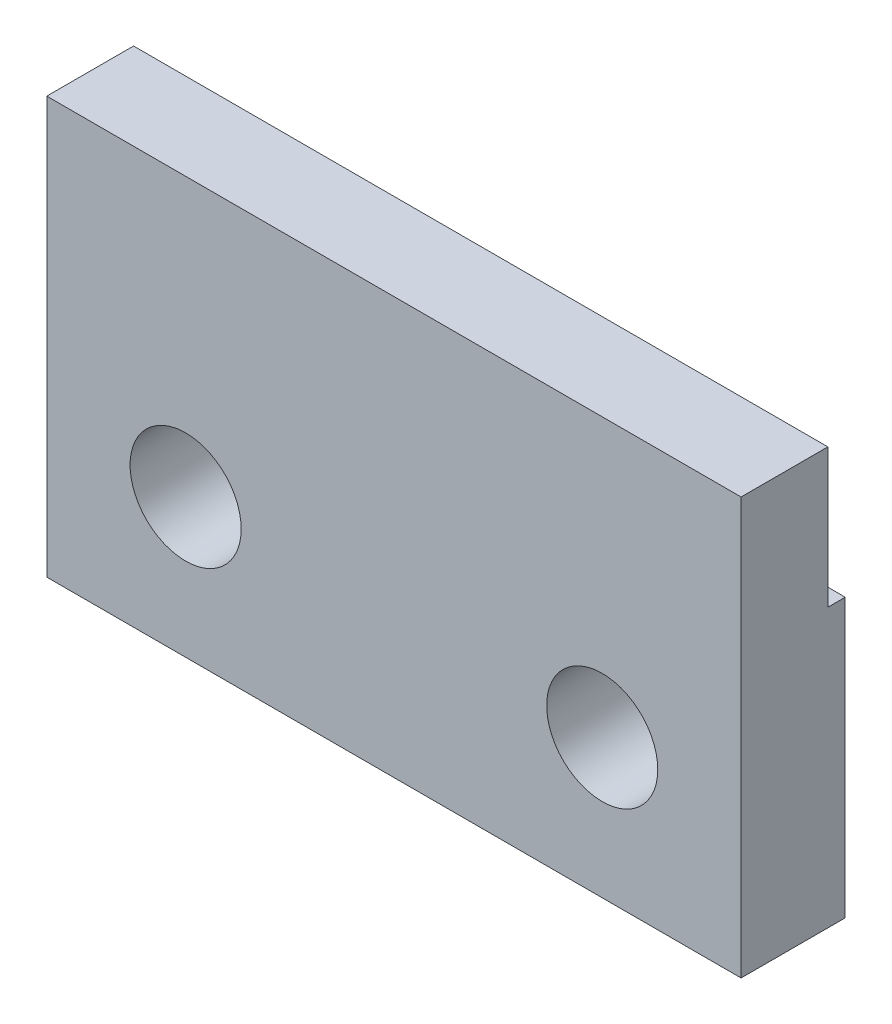
ISO-10303-21;
HEADER;
FILE_DESCRIPTION(('STEP AP214'),'2;1');
FILE_NAME('part.step','',(''),(''),'','','');
FILE_SCHEMA(('AUTOMOTIVE_DESIGN { 1 0 10303 214 1 1 1 1 }'));
ENDSEC;
DATA;
#1=APPLICATION_CONTEXT('core data for automotive mechanical design processes');
#2=APPLICATION_PROTOCOL_DEFINITION('international standard','automotive_design',2000,#1);
#3=PRODUCT_CONTEXT('',#1,'mechanical');
#4=PRODUCT('Part','Part','',(#3));
#5=PRODUCT_RELATED_PRODUCT_CATEGORY('part','',(#4));
#6=PRODUCT_DEFINITION_FORMATION('','',#4);
#7=PRODUCT_DEFINITION_CONTEXT('part definition',#1,'design');
#8=PRODUCT_DEFINITION('design','',#6,#7);
#9=PRODUCT_DEFINITION_SHAPE('','',#8);
#10=(LENGTH_UNIT() NAMED_UNIT(*) SI_UNIT(.MILLI.,.METRE.));
#11=(NAMED_UNIT(*) PLANE_ANGLE_UNIT() SI_UNIT($,.RADIAN.));
#12=(NAMED_UNIT(*) SI_UNIT($,.STERADIAN.) SOLID_ANGLE_UNIT());
#13=UNCERTAINTY_MEASURE_WITH_UNIT(LENGTH_MEASURE(1.E-05),#10,'distance_accuracy_value','');
#14=(GEOMETRIC_REPRESENTATION_CONTEXT(3) GLOBAL_UNCERTAINTY_ASSIGNED_CONTEXT((#13)) GLOBAL_UNIT_ASSIGNED_CONTEXT((#10,
#11,#12)) REPRESENTATION_CONTEXT('',''));
#15=CARTESIAN_POINT('',(0.,0.,0.));
#16=DIRECTION('',(0.,0.,1.));
#17=DIRECTION('',(1.,0.,0.));
#18=AXIS2_PLACEMENT_3D('',#15,#16,#17);
#19=CARTESIAN_POINT('',(10.,6.,3.));
#20=DIRECTION('',(0.,-1.,0.));
#21=DIRECTION('',(1.,0.,0.));
#22=AXIS2_PLACEMENT_3D('',#19,#20,#21);
#23=PLANE('',#22);
#24=DIRECTION('',(1.,0.,0.));
#25=VECTOR('',#24,1.);
#26=CARTESIAN_POINT('',(10.,6.,0.5));
#27=LINE('',#26,#25);
#28=CARTESIAN_POINT('',(-10.,6.,0.5));
#29=VERTEX_POINT('',#28);
#30=CARTESIAN_POINT('',(10.,6.,0.5));
#31=VERTEX_POINT('',#30);
#32=EDGE_CURVE('E108',#29,#31,#27,.T.);
#33=ORIENTED_EDGE('',*,*,#32,.F.);
#34=DIRECTION('',(0.,0.,-1.));
#35=VECTOR('',#34,1.);
#36=CARTESIAN_POINT('',(-10.,6.,3.));
#37=LINE('',#36,#35);
#38=CARTESIAN_POINT('',(-10.,6.,3.));
#39=VERTEX_POINT('',#38);
#40=EDGE_CURVE('E130',#39,#29,#37,.T.);
#41=ORIENTED_EDGE('',*,*,#40,.F.);
#42=DIRECTION('',(-1.,0.,0.));
#43=VECTOR('',#42,1.);
#44=CARTESIAN_POINT('',(10.,6.,3.));
#45=LINE('',#44,#43);
#46=CARTESIAN_POINT('',(10.,6.,3.));
#47=VERTEX_POINT('',#46);
#48=EDGE_CURVE('E61',#47,#39,#45,.T.);
#49=ORIENTED_EDGE('',*,*,#48,.F.);
#50=DIRECTION('',(0.,0.,-1.));
#51=VECTOR('',#50,1.);
#52=CARTESIAN_POINT('',(10.,6.,3.));
#53=LINE('',#52,#51);
#54=EDGE_CURVE('E136',#47,#31,#53,.T.);
#55=ORIENTED_EDGE('',*,*,#54,.T.);
#56=EDGE_LOOP('',(#33,#41,#49,#55));
#57=FACE_BOUND('',#56,.T.);
#58=ADVANCED_FACE('F37',(#57),#23,.F.);
#59=CARTESIAN_POINT('',(-10.,-6.,3.));
#60=DIRECTION('',(1.,0.,0.));
#61=DIRECTION('',(0.,0.,-1.));
#62=AXIS2_PLACEMENT_3D('',#59,#60,#61);
#63=PLANE('',#62);
#64=DIRECTION('',(0.,1.,0.));
#65=VECTOR('',#64,1.);
#66=CARTESIAN_POINT('',(-10.,6.,0.5));
#67=LINE('',#66,#65);
#68=CARTESIAN_POINT('',(-10.,2.,0.5));
#69=VERTEX_POINT('',#68);
#70=EDGE_CURVE('E102',#69,#29,#67,.T.);
#71=ORIENTED_EDGE('',*,*,#70,.F.);
#72=DIRECTION('',(0.,0.,-1.));
#73=VECTOR('',#72,1.);
#74=CARTESIAN_POINT('',(-10.,2.,0.5));
#75=LINE('',#74,#73);
#76=CARTESIAN_POINT('',(-10.,2.,0.));
#77=VERTEX_POINT('',#76);
#78=EDGE_CURVE('E99',#69,#77,#75,.T.);
#79=ORIENTED_EDGE('',*,*,#78,.T.);
#80=DIRECTION('',(0.,-1.,0.));
#81=VECTOR('',#80,1.);
#82=CARTESIAN_POINT('',(-10.,-6.,0.));
#83=LINE('',#82,#81);
#84=CARTESIAN_POINT('',(-10.,-6.,0.));
#85=VERTEX_POINT('',#84);
#86=EDGE_CURVE('E119',#77,#85,#83,.T.);
#87=ORIENTED_EDGE('',*,*,#86,.T.);
#88=DIRECTION('',(0.,0.,-1.));
#89=VECTOR('',#88,1.);
#90=CARTESIAN_POINT('',(-10.,-6.,3.));
#91=LINE('',#90,#89);
#92=CARTESIAN_POINT('',(-10.,-6.,3.));
#93=VERTEX_POINT('',#92);
#94=EDGE_CURVE('E11',#93,#85,#91,.T.);
#95=ORIENTED_EDGE('',*,*,#94,.F.);
#96=DIRECTION('',(0.,-1.,0.));
#97=VECTOR('',#96,1.);
#98=CARTESIAN_POINT('',(-10.,-6.,3.));
#99=LINE('',#98,#97);
#100=EDGE_CURVE('E124',#39,#93,#99,.T.);
#101=ORIENTED_EDGE('',*,*,#100,.F.);
#102=ORIENTED_EDGE('',*,*,#40,.T.);
#103=EDGE_LOOP('',(#71,#79,#87,#95,#101,#102));
#104=FACE_BOUND('',#103,.T.);
#105=ADVANCED_FACE('F39',(#104),#63,.F.);
#106=CARTESIAN_POINT('',(10.,-6.,3.));
#107=DIRECTION('',(0.,1.,0.));
#108=DIRECTION('',(-1.,0.,0.));
#109=AXIS2_PLACEMENT_3D('',#106,#107,#108);
#110=PLANE('',#109);
#111=DIRECTION('',(1.,0.,0.));
#112=VECTOR('',#111,1.);
#113=CARTESIAN_POINT('',(10.,-6.,0.));
#114=LINE('',#113,#112);
#115=CARTESIAN_POINT('',(10.,-6.,0.));
#116=VERTEX_POINT('',#115);
#117=EDGE_CURVE('E76',#85,#116,#114,.T.);
#118=ORIENTED_EDGE('',*,*,#117,.T.);
#119=DIRECTION('',(0.,0.,-1.));
#120=VECTOR('',#119,1.);
#121=CARTESIAN_POINT('',(10.,-6.,3.));
#122=LINE('',#121,#120);
#123=CARTESIAN_POINT('',(10.,-6.,3.));
#124=VERTEX_POINT('',#123);
#125=EDGE_CURVE('E45',#124,#116,#122,.T.);
#126=ORIENTED_EDGE('',*,*,#125,.F.);
#127=DIRECTION('',(1.,0.,0.));
#128=VECTOR('',#127,1.);
#129=CARTESIAN_POINT('',(10.,-6.,3.));
#130=LINE('',#129,#128);
#131=EDGE_CURVE('E81',#93,#124,#130,.T.);
#132=ORIENTED_EDGE('',*,*,#131,.F.);
#133=ORIENTED_EDGE('',*,*,#94,.T.);
#134=EDGE_LOOP('',(#118,#126,#132,#133));
#135=FACE_BOUND('',#134,.T.);
#136=ADVANCED_FACE('F166',(#135),#110,.F.);
#137=CARTESIAN_POINT('',(10.,-6.,3.));
#138=DIRECTION('',(-1.,0.,0.));
#139=DIRECTION('',(0.,0.,1.));
#140=AXIS2_PLACEMENT_3D('',#137,#138,#139);
#141=PLANE('',#140);
#142=DIRECTION('',(0.,1.,0.));
#143=VECTOR('',#142,1.);
#144=CARTESIAN_POINT('',(10.,-6.,0.));
#145=LINE('',#144,#143);
#146=CARTESIAN_POINT('',(10.,2.,0.));
#147=VERTEX_POINT('',#146);
#148=EDGE_CURVE('E117',#116,#147,#145,.T.);
#149=ORIENTED_EDGE('',*,*,#148,.T.);
#150=DIRECTION('',(0.,0.,-1.));
#151=VECTOR('',#150,1.);
#152=CARTESIAN_POINT('',(10.,2.,0.5));
#153=LINE('',#152,#151);
#154=CARTESIAN_POINT('',(10.,2.,0.5));
#155=VERTEX_POINT('',#154);
#156=EDGE_CURVE('E52',#155,#147,#153,.T.);
#157=ORIENTED_EDGE('',*,*,#156,.F.);
#158=DIRECTION('',(0.,-1.,0.));
#159=VECTOR('',#158,1.);
#160=CARTESIAN_POINT('',(10.,6.,0.5));
#161=LINE('',#160,#159);
#162=EDGE_CURVE('E103',#31,#155,#161,.T.);
#163=ORIENTED_EDGE('',*,*,#162,.F.);
#164=ORIENTED_EDGE('',*,*,#54,.F.);
#165=DIRECTION('',(0.,1.,0.));
#166=VECTOR('',#165,1.);
#167=CARTESIAN_POINT('',(10.,-6.,3.));
#168=LINE('',#167,#166);
#169=EDGE_CURVE('E127',#124,#47,#168,.T.);
#170=ORIENTED_EDGE('',*,*,#169,.F.);
#171=ORIENTED_EDGE('',*,*,#125,.T.);
#172=EDGE_LOOP('',(#149,#157,#163,#164,#170,#171));
#173=FACE_BOUND('',#172,.T.);
#174=ADVANCED_FACE('F115',(#173),#141,.F.);
#175=CARTESIAN_POINT('',(0.,0.,3.));
#176=DIRECTION('',(0.,0.,1.));
#177=DIRECTION('',(1.,0.,0.));
#178=AXIS2_PLACEMENT_3D('',#175,#176,#177);
#179=PLANE('',#178);
#180=CARTESIAN_POINT('',(-6.,-2.,3.));
#181=DIRECTION('',(0.,0.,1.));
#182=DIRECTION('',(1.,0.,0.));
#183=AXIS2_PLACEMENT_3D('',#180,#181,#182);
#184=CIRCLE('',#183,1.6);
#185=CARTESIAN_POINT('',(-4.4,-2.,3.));
#186=VERTEX_POINT('',#185);
#187=EDGE_CURVE('E152',#186,#186,#184,.T.);
#188=ORIENTED_EDGE('',*,*,#187,.F.);
#189=EDGE_LOOP('',(#188));
#190=FACE_BOUND('',#189,.T.);
#191=CARTESIAN_POINT('',(6.,-2.,3.));
#192=DIRECTION('',(0.,0.,1.));
#193=DIRECTION('',(1.,0.,0.));
#194=AXIS2_PLACEMENT_3D('',#191,#192,#193);
#195=CIRCLE('',#194,1.6);
#196=CARTESIAN_POINT('',(7.6,-2.,3.));
#197=VERTEX_POINT('',#196);
#198=EDGE_CURVE('E143',#197,#197,#195,.T.);
#199=ORIENTED_EDGE('',*,*,#198,.F.);
#200=EDGE_LOOP('',(#199));
#201=FACE_BOUND('',#200,.T.);
#202=ORIENTED_EDGE('',*,*,#100,.T.);
#203=ORIENTED_EDGE('',*,*,#131,.T.);
#204=ORIENTED_EDGE('',*,*,#169,.T.);
#205=ORIENTED_EDGE('',*,*,#48,.T.);
#206=EDGE_LOOP('',(#202,#203,#204,#205));
#207=FACE_BOUND('',#206,.T.);
#208=ADVANCED_FACE('F158',(#190,#201,#207),#179,.T.);
#209=CARTESIAN_POINT('',(0.,0.,0.));
#210=DIRECTION('',(0.,0.,1.));
#211=DIRECTION('',(1.,0.,0.));
#212=AXIS2_PLACEMENT_3D('',#209,#210,#211);
#213=PLANE('',#212);
#214=CARTESIAN_POINT('',(-6.,-2.,0.));
#215=DIRECTION('',(0.,0.,1.));
#216=DIRECTION('',(1.,0.,0.));
#217=AXIS2_PLACEMENT_3D('',#214,#215,#216);
#218=CIRCLE('',#217,1.6);
#219=CARTESIAN_POINT('',(-4.4,-2.,0.));
#220=VERTEX_POINT('',#219);
#221=EDGE_CURVE('E149',#220,#220,#218,.T.);
#222=ORIENTED_EDGE('',*,*,#221,.T.);
#223=EDGE_LOOP('',(#222));
#224=FACE_BOUND('',#223,.T.);
#225=CARTESIAN_POINT('',(6.,-2.,0.));
#226=DIRECTION('',(0.,0.,1.));
#227=DIRECTION('',(1.,0.,0.));
#228=AXIS2_PLACEMENT_3D('',#225,#226,#227);
#229=CIRCLE('',#228,1.6);
#230=CARTESIAN_POINT('',(7.6,-2.,0.));
#231=VERTEX_POINT('',#230);
#232=EDGE_CURVE('E141',#231,#231,#229,.T.);
#233=ORIENTED_EDGE('',*,*,#232,.T.);
#234=EDGE_LOOP('',(#233));
#235=FACE_BOUND('',#234,.T.);
#236=ORIENTED_EDGE('',*,*,#86,.F.);
#237=DIRECTION('',(-1.,0.,0.));
#238=VECTOR('',#237,1.);
#239=CARTESIAN_POINT('',(10.,2.,0.));
#240=LINE('',#239,#238);
#241=EDGE_CURVE('E112',#147,#77,#240,.T.);
#242=ORIENTED_EDGE('',*,*,#241,.F.);
#243=ORIENTED_EDGE('',*,*,#148,.F.);
#244=ORIENTED_EDGE('',*,*,#117,.F.);
#245=EDGE_LOOP('',(#236,#242,#243,#244));
#246=FACE_BOUND('',#245,.T.);
#247=ADVANCED_FACE('F140',(#224,#235,#246),#213,.F.);
#248=CARTESIAN_POINT('',(10.,2.,0.5));
#249=DIRECTION('',(0.,-1.,0.));
#250=DIRECTION('',(0.,0.,-1.));
#251=AXIS2_PLACEMENT_3D('',#248,#249,#250);
#252=PLANE('',#251);
#253=ORIENTED_EDGE('',*,*,#241,.T.);
#254=ORIENTED_EDGE('',*,*,#78,.F.);
#255=DIRECTION('',(-1.,0.,0.));
#256=VECTOR('',#255,1.);
#257=CARTESIAN_POINT('',(10.,2.,0.5));
#258=LINE('',#257,#256);
#259=EDGE_CURVE('E95',#155,#69,#258,.T.);
#260=ORIENTED_EDGE('',*,*,#259,.F.);
#261=ORIENTED_EDGE('',*,*,#156,.T.);
#262=EDGE_LOOP('',(#253,#254,#260,#261));
#263=FACE_BOUND('',#262,.T.);
#264=ADVANCED_FACE('F97',(#263),#252,.F.);
#265=CARTESIAN_POINT('',(0.,0.,0.5));
#266=DIRECTION('',(0.,0.,-1.));
#267=DIRECTION('',(-1.,0.,0.));
#268=AXIS2_PLACEMENT_3D('',#265,#266,#267);
#269=PLANE('',#268);
#270=ORIENTED_EDGE('',*,*,#162,.T.);
#271=ORIENTED_EDGE('',*,*,#259,.T.);
#272=ORIENTED_EDGE('',*,*,#70,.T.);
#273=ORIENTED_EDGE('',*,*,#32,.T.);
#274=EDGE_LOOP('',(#270,#271,#272,#273));
#275=FACE_BOUND('',#274,.T.);
#276=ADVANCED_FACE('F106',(#275),#269,.T.);
#277=CARTESIAN_POINT('',(6.,-2.,3.));
#278=DIRECTION('',(0.,0.,1.));
#279=DIRECTION('',(1.,0.,0.));
#280=AXIS2_PLACEMENT_3D('',#277,#278,#279);
#281=CYLINDRICAL_SURFACE('',#280,1.6);
#282=ORIENTED_EDGE('',*,*,#232,.F.);
#283=EDGE_LOOP('',(#282));
#284=FACE_BOUND('',#283,.T.);
#285=ORIENTED_EDGE('',*,*,#198,.T.);
#286=EDGE_LOOP('',(#285));
#287=FACE_BOUND('',#286,.T.);
#288=ADVANCED_FACE('F186',(#284,#287),#281,.F.);
#289=CARTESIAN_POINT('',(-6.,-2.,3.));
#290=DIRECTION('',(0.,0.,1.));
#291=DIRECTION('',(1.,0.,0.));
#292=AXIS2_PLACEMENT_3D('',#289,#290,#291);
#293=CYLINDRICAL_SURFACE('',#292,1.6);
#294=ORIENTED_EDGE('',*,*,#221,.F.);
#295=EDGE_LOOP('',(#294));
#296=FACE_BOUND('',#295,.T.);
#297=ORIENTED_EDGE('',*,*,#187,.T.);
#298=EDGE_LOOP('',(#297));
#299=FACE_BOUND('',#298,.T.);
#300=ADVANCED_FACE('F156',(#296,#299),#293,.F.);
#301=CLOSED_SHELL('',(#58,#105,#136,#174,#208,#247,#264,#276,#288,#300));
#302=MANIFOLD_SOLID_BREP('B2',#301);
#303=ADVANCED_BREP_SHAPE_REPRESENTATION('',(#18,#302),#14);
#304=SHAPE_DEFINITION_REPRESENTATION(#9,#303);
ENDSEC;
END-ISO-10303-21;
